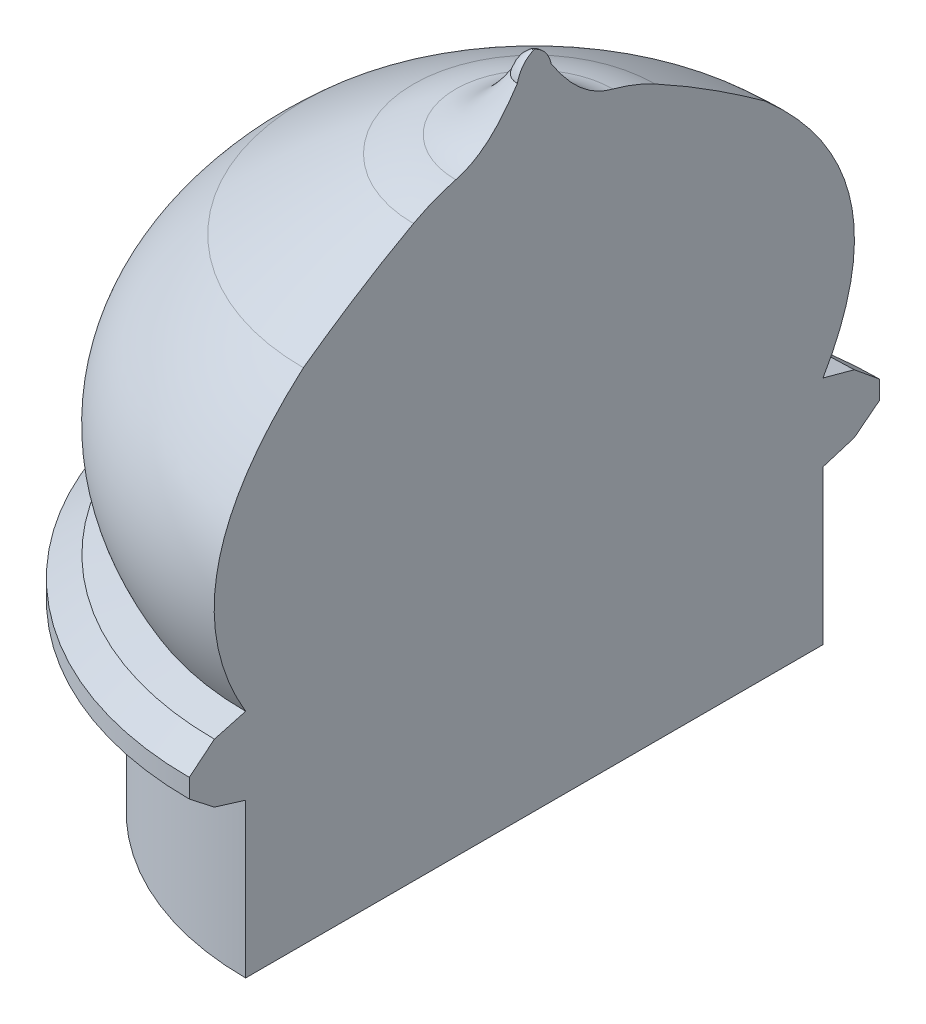
ISO-10303-21;
HEADER;
FILE_DESCRIPTION(('STEP AP214'),'2;1');
FILE_NAME('part.step','',(''),(''),'','','');
FILE_SCHEMA(('AUTOMOTIVE_DESIGN { 1 0 10303 214 1 1 1 1 }'));
ENDSEC;
DATA;
#1=APPLICATION_CONTEXT('core data for automotive mechanical design processes');
#2=APPLICATION_PROTOCOL_DEFINITION('international standard','automotive_design',2000,#1);
#3=PRODUCT_CONTEXT('',#1,'mechanical');
#4=PRODUCT('Part','Part','',(#3));
#5=PRODUCT_RELATED_PRODUCT_CATEGORY('part','',(#4));
#6=PRODUCT_DEFINITION_FORMATION('','',#4);
#7=PRODUCT_DEFINITION_CONTEXT('part definition',#1,'design');
#8=PRODUCT_DEFINITION('design','',#6,#7);
#9=PRODUCT_DEFINITION_SHAPE('','',#8);
#10=(LENGTH_UNIT() NAMED_UNIT(*) SI_UNIT(.MILLI.,.METRE.));
#11=(NAMED_UNIT(*) PLANE_ANGLE_UNIT() SI_UNIT($,.RADIAN.));
#12=(NAMED_UNIT(*) SI_UNIT($,.STERADIAN.) SOLID_ANGLE_UNIT());
#13=UNCERTAINTY_MEASURE_WITH_UNIT(LENGTH_MEASURE(1.E-05),#10,'distance_accuracy_value','');
#14=(GEOMETRIC_REPRESENTATION_CONTEXT(3) GLOBAL_UNCERTAINTY_ASSIGNED_CONTEXT((#13)) GLOBAL_UNIT_ASSIGNED_CONTEXT((#10,
#11,#12)) REPRESENTATION_CONTEXT('',''));
#15=CARTESIAN_POINT('',(0.,0.,0.));
#16=DIRECTION('',(0.,0.,1.));
#17=DIRECTION('',(1.,0.,0.));
#18=AXIS2_PLACEMENT_3D('',#15,#16,#17);
#19=CARTESIAN_POINT('',(0.,0.,0.));
#20=DIRECTION('',(0.,-1.,0.));
#21=DIRECTION('',(0.,0.,-1.));
#22=AXIS2_PLACEMENT_3D('',#19,#20,#21);
#23=PLANE('',#22);
#24=DIRECTION('',(0.,0.,1.));
#25=VECTOR('',#24,1.);
#26=CARTESIAN_POINT('',(0.,0.,0.));
#27=LINE('',#26,#25);
#28=CARTESIAN_POINT('',(1.33025439009923E-13,0.,-19.05));
#29=VERTEX_POINT('',#28);
#30=CARTESIAN_POINT('',(0.,0.,19.05));
#31=VERTEX_POINT('',#30);
#32=EDGE_CURVE('E180',#29,#31,#27,.T.);
#33=ORIENTED_EDGE('',*,*,#32,.T.);
#34=CARTESIAN_POINT('',(0.,0.,0.));
#35=DIRECTION('',(0.,1.,0.));
#36=DIRECTION('',(0.,0.,1.));
#37=AXIS2_PLACEMENT_3D('',#34,#35,#36);
#38=CIRCLE('',#37,19.05);
#39=EDGE_CURVE('E48',#29,#31,#38,.T.);
#40=ORIENTED_EDGE('',*,*,#39,.F.);
#41=EDGE_LOOP('',(#33,#40));
#42=FACE_BOUND('',#41,.T.);
#43=ADVANCED_FACE('F33',(#42),#23,.T.);
#44=CARTESIAN_POINT('',(0.,43.5542287768964,0.));
#45=CARTESIAN_POINT('',(0.,43.1584910491297,-0.886078473245657));
#46=CARTESIAN_POINT('',(0.,42.156292635422,-1.11862169887722));
#47=B_SPLINE_CURVE_WITH_KNOTS('',2,(#44,#45,#46),.UNSPECIFIED.,.F.,.F.,(3,3),(0.,1.),.UNSPECIFIED.);
#48=CARTESIAN_POINT('',(0.,43.5542287768964,0.));
#49=DIRECTION('',(0.,1.,0.));
#50=AXIS1_PLACEMENT('',#48,#49);
#51=SURFACE_OF_REVOLUTION('',#47,#50);
#52=CARTESIAN_POINT('',(0.,42.156292635422,0.));
#53=DIRECTION('',(0.,1.,0.));
#54=DIRECTION('',(0.,0.,1.));
#55=AXIS2_PLACEMENT_3D('',#52,#53,#54);
#56=CIRCLE('',#55,1.11862169887722);
#57=CARTESIAN_POINT('',(0.,42.156292635422,-1.11862169887722));
#58=VERTEX_POINT('',#57);
#59=CARTESIAN_POINT('',(0.,42.156292635422,1.11862169887722));
#60=VERTEX_POINT('',#59);
#61=EDGE_CURVE('E11',#58,#60,#56,.T.);
#62=ORIENTED_EDGE('',*,*,#61,.T.);
#63=CARTESIAN_POINT('',(0.,43.5542287768964,0.));
#64=CARTESIAN_POINT('',(0.,43.1584910491297,0.886078473245657));
#65=CARTESIAN_POINT('',(0.,42.156292635422,1.11862169887722));
#66=B_SPLINE_CURVE_WITH_KNOTS('',2,(#63,#64,#65),.UNSPECIFIED.,.F.,.F.,(3,3),(0.,1.),.UNSPECIFIED.);
#67=CARTESIAN_POINT('',(0.,43.5542287768964,0.));
#68=VERTEX_POINT('',#67);
#69=EDGE_CURVE('E120',#68,#60,#66,.T.);
#70=ORIENTED_EDGE('',*,*,#69,.F.);
#71=EDGE_CURVE('E122',#68,#58,#47,.T.);
#72=ORIENTED_EDGE('',*,*,#71,.T.);
#73=EDGE_LOOP('',(#62,#70,#72));
#74=FACE_BOUND('',#73,.T.);
#75=ADVANCED_FACE('F35',(#74),#51,.F.);
#76=CARTESIAN_POINT('',(0.,42.156292635422,-1.11862169887722));
#77=CARTESIAN_POINT('',(0.,40.6567927305474,-2.1048032632789));
#78=CARTESIAN_POINT('',(0.,39.1509662280635,-3.35105722555367));
#79=CARTESIAN_POINT('',(0.,38.6864077279948,-5.18636122685137));
#80=B_SPLINE_CURVE_WITH_KNOTS('',3,(#76,#77,#78,#79),.UNSPECIFIED.,.F.,.F.,(4,4),(0.,1.),.UNSPECIFIED.);
#81=CARTESIAN_POINT('',(0.,43.5542287768964,0.));
#82=DIRECTION('',(0.,1.,0.));
#83=AXIS1_PLACEMENT('',#81,#82);
#84=SURFACE_OF_REVOLUTION('',#80,#83);
#85=CARTESIAN_POINT('',(0.,38.6864077279948,0.));
#86=DIRECTION('',(0.,1.,0.));
#87=DIRECTION('',(0.,0.,1.));
#88=AXIS2_PLACEMENT_3D('',#85,#86,#87);
#89=CIRCLE('',#88,5.18636122685137);
#90=CARTESIAN_POINT('',(0.,38.6864077279948,-5.18636122685137));
#91=VERTEX_POINT('',#90);
#92=CARTESIAN_POINT('',(0.,38.6864077279948,5.18636122685137));
#93=VERTEX_POINT('',#92);
#94=EDGE_CURVE('E42',#91,#93,#89,.T.);
#95=ORIENTED_EDGE('',*,*,#94,.T.);
#96=CARTESIAN_POINT('',(0.,42.156292635422,1.11862169887722));
#97=CARTESIAN_POINT('',(0.,40.6567927305474,2.1048032632789));
#98=CARTESIAN_POINT('',(0.,39.1509662280635,3.35105722555367));
#99=CARTESIAN_POINT('',(0.,38.6864077279948,5.18636122685137));
#100=B_SPLINE_CURVE_WITH_KNOTS('',3,(#96,#97,#98,#99),.UNSPECIFIED.,.F.,.F.,(4,4),(0.,1.),.UNSPECIFIED.);
#101=EDGE_CURVE('E131',#60,#93,#100,.T.);
#102=ORIENTED_EDGE('',*,*,#101,.F.);
#103=ORIENTED_EDGE('',*,*,#61,.F.);
#104=EDGE_CURVE('E185',#58,#91,#80,.T.);
#105=ORIENTED_EDGE('',*,*,#104,.T.);
#106=EDGE_LOOP('',(#95,#102,#103,#105));
#107=FACE_BOUND('',#106,.T.);
#108=ADVANCED_FACE('F134',(#107),#84,.F.);
#109=CARTESIAN_POINT('',(0.,26.4127765045811,0.));
#110=DIRECTION('',(0.,1.,0.));
#111=DIRECTION('',(0.,0.,1.));
#112=AXIS2_PLACEMENT_3D('',#109,#110,#111);
#113=DEGENERATE_TOROIDAL_SURFACE('',#112,1.92323747932899,12.7,.T.);
#114=CARTESIAN_POINT('',(0.,37.578839170999,0.));
#115=DIRECTION('',(0.,1.,0.));
#116=DIRECTION('',(0.,0.,1.));
#117=AXIS2_PLACEMENT_3D('',#114,#115,#116);
#118=CIRCLE('',#117,7.9737783253714);
#119=CARTESIAN_POINT('',(0.,37.578839170999,-7.9737783253714));
#120=VERTEX_POINT('',#119);
#121=CARTESIAN_POINT('',(0.,37.578839170999,7.9737783253714));
#122=VERTEX_POINT('',#121);
#123=EDGE_CURVE('E258',#120,#122,#118,.T.);
#124=ORIENTED_EDGE('',*,*,#123,.T.);
#125=CARTESIAN_POINT('',(0.,26.4127765045811,1.92323747932899));
#126=DIRECTION('',(1.,0.,0.));
#127=DIRECTION('',(0.,0.,-1.));
#128=AXIS2_PLACEMENT_3D('',#125,#126,#127);
#129=CIRCLE('',#128,12.7);
#130=EDGE_CURVE('E135',#93,#122,#129,.T.);
#131=ORIENTED_EDGE('',*,*,#130,.F.);
#132=ORIENTED_EDGE('',*,*,#94,.F.);
#133=CARTESIAN_POINT('',(0.,26.4127765045811,-1.92323747932899));
#134=DIRECTION('',(-1.,0.,0.));
#135=DIRECTION('',(0.,0.,1.));
#136=AXIS2_PLACEMENT_3D('',#133,#134,#135);
#137=CIRCLE('',#136,12.7);
#138=EDGE_CURVE('E193',#91,#120,#137,.T.);
#139=ORIENTED_EDGE('',*,*,#138,.T.);
#140=EDGE_LOOP('',(#124,#131,#132,#139));
#141=FACE_BOUND('',#140,.T.);
#142=ADVANCED_FACE('F200',(#141),#113,.T.);
#143=CARTESIAN_POINT('',(0.,37.578839170999,-7.9737783253714));
#144=CARTESIAN_POINT('',(0.,37.4332726743377,-8.24241623150419));
#145=CARTESIAN_POINT('',(0.,36.0447468834401,-10.754138267883));
#146=CARTESIAN_POINT('',(0.,34.4667611992356,-13.1590560108881));
#147=CARTESIAN_POINT('',(1.06420351207939E-13,32.9695941861274,-15.24));
#148=B_SPLINE_CURVE_WITH_KNOTS('',3,(#143,#144,#145,#146,#147),.UNSPECIFIED.,.F.,.F.,(4,1,4),
(0.,0.0869963219725777,0.817134496217746),.UNSPECIFIED.);
#149=CARTESIAN_POINT('',(0.,43.5542287768964,0.));
#150=DIRECTION('',(0.,1.,0.));
#151=AXIS1_PLACEMENT('',#149,#150);
#152=SURFACE_OF_REVOLUTION('',#148,#151);
#153=CARTESIAN_POINT('',(0.,32.9695941861274,0.));
#154=DIRECTION('',(0.,1.,0.));
#155=DIRECTION('',(0.,0.,1.));
#156=AXIS2_PLACEMENT_3D('',#153,#154,#155);
#157=CIRCLE('',#156,15.24);
#158=CARTESIAN_POINT('',(1.06420351207939E-13,32.9695941861274,-15.24));
#159=VERTEX_POINT('',#158);
#160=CARTESIAN_POINT('',(0.,32.9695941861274,15.24));
#161=VERTEX_POINT('',#160);
#162=EDGE_CURVE('E256',#159,#161,#157,.T.);
#163=ORIENTED_EDGE('',*,*,#162,.T.);
#164=CARTESIAN_POINT('',(0.,37.578839170999,7.9737783253714));
#165=CARTESIAN_POINT('',(0.,37.4332726743377,8.24241623150419));
#166=CARTESIAN_POINT('',(0.,36.0447468834401,10.754138267883));
#167=CARTESIAN_POINT('',(0.,34.4667611992356,13.1590560108881));
#168=CARTESIAN_POINT('',(0.,32.9695941861274,15.24));
#169=B_SPLINE_CURVE_WITH_KNOTS('',3,(#164,#165,#166,#167,#168),.UNSPECIFIED.,.F.,.F.,(4,1,4),
(0.,0.0869963219725777,0.817134496217746),.UNSPECIFIED.);
#170=EDGE_CURVE('E137',#122,#161,#169,.T.);
#171=ORIENTED_EDGE('',*,*,#170,.F.);
#172=ORIENTED_EDGE('',*,*,#123,.F.);
#173=EDGE_CURVE('E211',#120,#159,#148,.T.);
#174=ORIENTED_EDGE('',*,*,#173,.T.);
#175=EDGE_LOOP('',(#163,#171,#172,#174));
#176=FACE_BOUND('',#175,.T.);
#177=ADVANCED_FACE('F203',(#176),#152,.F.);
#178=CARTESIAN_POINT('',(1.06420351207939E-13,32.9695941861274,-15.24));
#179=CARTESIAN_POINT('',(1.71917437599164E-13,24.713120096452,-24.6195555574883));
#180=CARTESIAN_POINT('',(1.33025439009923E-13,15.24,-19.05));
#181=B_SPLINE_CURVE_WITH_KNOTS('',2,(#178,#179,#180),.UNSPECIFIED.,.F.,.F.,(3,3),(0.,1.),.UNSPECIFIED.);
#182=CARTESIAN_POINT('',(0.,43.5542287768964,0.));
#183=DIRECTION('',(0.,1.,0.));
#184=AXIS1_PLACEMENT('',#182,#183);
#185=SURFACE_OF_REVOLUTION('',#181,#184);
#186=CARTESIAN_POINT('',(0.,15.24,0.));
#187=DIRECTION('',(0.,1.,0.));
#188=DIRECTION('',(0.,0.,1.));
#189=AXIS2_PLACEMENT_3D('',#186,#187,#188);
#190=CIRCLE('',#189,19.05);
#191=CARTESIAN_POINT('',(1.33025439009923E-13,15.24,-19.05));
#192=VERTEX_POINT('',#191);
#193=CARTESIAN_POINT('',(0.,15.24,19.05));
#194=VERTEX_POINT('',#193);
#195=EDGE_CURVE('E254',#192,#194,#190,.T.);
#196=ORIENTED_EDGE('',*,*,#195,.T.);
#197=CARTESIAN_POINT('',(0.,32.9695941861274,15.24));
#198=CARTESIAN_POINT('',(0.,24.713120096452,24.6195555574883));
#199=CARTESIAN_POINT('',(0.,15.24,19.05));
#200=B_SPLINE_CURVE_WITH_KNOTS('',2,(#197,#198,#199),.UNSPECIFIED.,.F.,.F.,(3,3),(0.,1.),.UNSPECIFIED.);
#201=EDGE_CURVE('E151',#161,#194,#200,.T.);
#202=ORIENTED_EDGE('',*,*,#201,.F.);
#203=ORIENTED_EDGE('',*,*,#162,.F.);
#204=EDGE_CURVE('E216',#159,#192,#181,.T.);
#205=ORIENTED_EDGE('',*,*,#204,.T.);
#206=EDGE_LOOP('',(#196,#202,#203,#205));
#207=FACE_BOUND('',#206,.T.);
#208=ADVANCED_FACE('F207',(#207),#185,.F.);
#209=CARTESIAN_POINT('',(0.,15.24,0.));
#210=DIRECTION('',(0.,-1.,0.));
#211=DIRECTION('',(0.,0.,-1.));
#212=AXIS2_PLACEMENT_3D('',#209,#210,#211);
#213=CONICAL_SURFACE('',#212,19.05,1.30586539917777);
#214=CARTESIAN_POINT('',(0.,14.6806431808635,0.));
#215=DIRECTION('',(0.,1.,0.));
#216=DIRECTION('',(0.,0.,1.));
#217=AXIS2_PLACEMENT_3D('',#214,#215,#216);
#218=CIRCLE('',#217,21.1117010997163);
#219=CARTESIAN_POINT('',(1.47422220841787E-13,14.6806431808635,-21.1117010997163));
#220=VERTEX_POINT('',#219);
#221=CARTESIAN_POINT('',(0.,14.6806431808635,21.1117010997163));
#222=VERTEX_POINT('',#221);
#223=EDGE_CURVE('E252',#220,#222,#218,.T.);
#224=ORIENTED_EDGE('',*,*,#223,.T.);
#225=DIRECTION('',(0.,-0.261842606286069,0.965110589276337));
#226=VECTOR('',#225,1.);
#227=CARTESIAN_POINT('',(0.,14.6806431808635,21.1117010997163));
#228=LINE('',#227,#226);
#229=EDGE_CURVE('E159',#194,#222,#228,.T.);
#230=ORIENTED_EDGE('',*,*,#229,.F.);
#231=ORIENTED_EDGE('',*,*,#195,.F.);
#232=DIRECTION('',(0.,-0.261842606286069,-0.965110589276337));
#233=VECTOR('',#232,1.);
#234=CARTESIAN_POINT('',(1.47422220841787E-13,14.6806431808635,-21.1117010997163));
#235=LINE('',#234,#233);
#236=EDGE_CURVE('E225',#192,#220,#235,.T.);
#237=ORIENTED_EDGE('',*,*,#236,.T.);
#238=EDGE_LOOP('',(#224,#230,#231,#237));
#239=FACE_BOUND('',#238,.T.);
#240=ADVANCED_FACE('F270',(#239),#213,.T.);
#241=CARTESIAN_POINT('',(0.,14.6806431808635,0.));
#242=DIRECTION('',(0.,-1.,0.));
#243=DIRECTION('',(0.,0.,-1.));
#244=AXIS2_PLACEMENT_3D('',#241,#242,#243);
#245=CONICAL_SURFACE('',#244,21.1117010997163,0.884216258093348);
#246=CARTESIAN_POINT('',(0.,13.3233278651338,0.));
#247=DIRECTION('',(0.,1.,0.));
#248=DIRECTION('',(0.,0.,1.));
#249=AXIS2_PLACEMENT_3D('',#246,#247,#248);
#250=CIRCLE('',#249,22.767765968934);
#251=CARTESIAN_POINT('',(1.58986460015362E-13,13.3233278651338,-22.767765968934));
#252=VERTEX_POINT('',#251);
#253=CARTESIAN_POINT('',(0.,13.3233278651338,22.767765968934));
#254=VERTEX_POINT('',#253);
#255=EDGE_CURVE('E250',#252,#254,#250,.T.);
#256=ORIENTED_EDGE('',*,*,#255,.T.);
#257=DIRECTION('',(0.,-0.633895856534455,0.773418413970374));
#258=VECTOR('',#257,1.);
#259=CARTESIAN_POINT('',(0.,13.3233278651338,22.767765968934));
#260=LINE('',#259,#258);
#261=EDGE_CURVE('E165',#222,#254,#260,.T.);
#262=ORIENTED_EDGE('',*,*,#261,.F.);
#263=ORIENTED_EDGE('',*,*,#223,.F.);
#264=DIRECTION('',(0.,-0.633895856534455,-0.773418413970374));
#265=VECTOR('',#264,1.);
#266=CARTESIAN_POINT('',(1.58986460015362E-13,13.3233278651338,-22.767765968934));
#267=LINE('',#266,#265);
#268=EDGE_CURVE('E231',#220,#252,#267,.T.);
#269=ORIENTED_EDGE('',*,*,#268,.T.);
#270=EDGE_LOOP('',(#256,#262,#263,#269));
#271=FACE_BOUND('',#270,.T.);
#272=ADVANCED_FACE('F273',(#271),#245,.T.);
#273=CARTESIAN_POINT('',(0.,43.5542287768964,0.));
#274=DIRECTION('',(0.,1.,0.));
#275=DIRECTION('',(0.,0.,1.));
#276=AXIS2_PLACEMENT_3D('',#273,#274,#275);
#277=CYLINDRICAL_SURFACE('',#276,22.767765968934);
#278=CARTESIAN_POINT('',(0.,12.084590197272,0.));
#279=DIRECTION('',(0.,1.,0.));
#280=DIRECTION('',(0.,0.,1.));
#281=AXIS2_PLACEMENT_3D('',#278,#279,#280);
#282=CIRCLE('',#281,22.767765968934);
#283=CARTESIAN_POINT('',(1.58986460015362E-13,12.084590197272,-22.767765968934));
#284=VERTEX_POINT('',#283);
#285=CARTESIAN_POINT('',(0.,12.084590197272,22.767765968934));
#286=VERTEX_POINT('',#285);
#287=EDGE_CURVE('E248',#284,#286,#282,.T.);
#288=ORIENTED_EDGE('',*,*,#287,.T.);
#289=DIRECTION('',(0.,-1.,0.));
#290=VECTOR('',#289,1.);
#291=CARTESIAN_POINT('',(0.,12.084590197272,22.767765968934));
#292=LINE('',#291,#290);
#293=EDGE_CURVE('E168',#254,#286,#292,.T.);
#294=ORIENTED_EDGE('',*,*,#293,.F.);
#295=ORIENTED_EDGE('',*,*,#255,.F.);
#296=DIRECTION('',(0.,-1.,0.));
#297=VECTOR('',#296,1.);
#298=CARTESIAN_POINT('',(1.58986460015362E-13,12.084590197272,-22.767765968934));
#299=LINE('',#298,#297);
#300=EDGE_CURVE('E234',#252,#284,#299,.T.);
#301=ORIENTED_EDGE('',*,*,#300,.T.);
#302=EDGE_LOOP('',(#288,#294,#295,#301));
#303=FACE_BOUND('',#302,.T.);
#304=ADVANCED_FACE('F278',(#303),#277,.T.);
#305=CARTESIAN_POINT('',(0.,12.084590197272,0.));
#306=DIRECTION('',(0.,1.,0.));
#307=DIRECTION('',(0.,0.,1.));
#308=AXIS2_PLACEMENT_3D('',#305,#306,#307);
#309=CONICAL_SURFACE('',#308,22.767765968934,0.909174106703724);
#310=CARTESIAN_POINT('',(0.,10.795,0.));
#311=DIRECTION('',(0.,1.,0.));
#312=DIRECTION('',(0.,0.,1.));
#313=AXIS2_PLACEMENT_3D('',#310,#311,#312);
#314=CIRCLE('',#313,21.1117010997163);
#315=CARTESIAN_POINT('',(1.47422220841787E-13,10.795,-21.1117010997163));
#316=VERTEX_POINT('',#315);
#317=CARTESIAN_POINT('',(0.,10.795,21.1117010997163));
#318=VERTEX_POINT('',#317);
#319=EDGE_CURVE('E246',#316,#318,#314,.T.);
#320=ORIENTED_EDGE('',*,*,#319,.T.);
#321=DIRECTION('',(0.,-0.614397585942785,-0.788996581987323));
#322=VECTOR('',#321,1.);
#323=CARTESIAN_POINT('',(0.,10.795,21.1117010997163));
#324=LINE('',#323,#322);
#325=EDGE_CURVE('E171',#286,#318,#324,.T.);
#326=ORIENTED_EDGE('',*,*,#325,.F.);
#327=ORIENTED_EDGE('',*,*,#287,.F.);
#328=DIRECTION('',(0.,-0.614397585942785,0.788996581987323));
#329=VECTOR('',#328,1.);
#330=CARTESIAN_POINT('',(1.47422220841787E-13,10.795,-21.1117010997163));
#331=LINE('',#330,#329);
#332=EDGE_CURVE('E237',#284,#316,#331,.T.);
#333=ORIENTED_EDGE('',*,*,#332,.T.);
#334=EDGE_LOOP('',(#320,#326,#327,#333));
#335=FACE_BOUND('',#334,.T.);
#336=ADVANCED_FACE('F281',(#335),#309,.T.);
#337=CARTESIAN_POINT('',(0.,10.795,0.));
#338=DIRECTION('',(0.,1.,0.));
#339=DIRECTION('',(0.,0.,1.));
#340=AXIS2_PLACEMENT_3D('',#337,#338,#339);
#341=CONICAL_SURFACE('',#340,21.1117010997163,1.27201808333505);
#342=CARTESIAN_POINT('',(0.,10.16,0.));
#343=DIRECTION('',(0.,1.,0.));
#344=DIRECTION('',(0.,0.,1.));
#345=AXIS2_PLACEMENT_3D('',#342,#343,#344);
#346=CIRCLE('',#345,19.05);
#347=CARTESIAN_POINT('',(1.33025439009923E-13,10.16,-19.05));
#348=VERTEX_POINT('',#347);
#349=CARTESIAN_POINT('',(0.,10.16,19.05));
#350=VERTEX_POINT('',#349);
#351=EDGE_CURVE('E56',#348,#350,#346,.T.);
#352=ORIENTED_EDGE('',*,*,#351,.T.);
#353=DIRECTION('',(0.,-0.294352797788221,-0.955696829770951));
#354=VECTOR('',#353,1.);
#355=CARTESIAN_POINT('',(0.,10.16,19.05));
#356=LINE('',#355,#354);
#357=EDGE_CURVE('E174',#318,#350,#356,.T.);
#358=ORIENTED_EDGE('',*,*,#357,.F.);
#359=ORIENTED_EDGE('',*,*,#319,.F.);
#360=DIRECTION('',(0.,-0.294352797788221,0.955696829770951));
#361=VECTOR('',#360,1.);
#362=CARTESIAN_POINT('',(1.33025439009923E-13,10.16,-19.05));
#363=LINE('',#362,#361);
#364=EDGE_CURVE('E240',#316,#348,#363,.T.);
#365=ORIENTED_EDGE('',*,*,#364,.T.);
#366=EDGE_LOOP('',(#352,#358,#359,#365));
#367=FACE_BOUND('',#366,.T.);
#368=ADVANCED_FACE('F285',(#367),#341,.T.);
#369=CARTESIAN_POINT('',(0.,43.5542287768964,0.));
#370=DIRECTION('',(0.,1.,0.));
#371=DIRECTION('',(0.,0.,1.));
#372=AXIS2_PLACEMENT_3D('',#369,#370,#371);
#373=CYLINDRICAL_SURFACE('',#372,19.05);
#374=DIRECTION('',(0.,-1.,0.));
#375=VECTOR('',#374,1.);
#376=CARTESIAN_POINT('',(1.33025439009923E-13,0.,-19.05));
#377=LINE('',#376,#375);
#378=EDGE_CURVE('E242',#348,#29,#377,.T.);
#379=ORIENTED_EDGE('',*,*,#378,.T.);
#380=ORIENTED_EDGE('',*,*,#39,.T.);
#381=DIRECTION('',(0.,-1.,0.));
#382=VECTOR('',#381,1.);
#383=CARTESIAN_POINT('',(0.,0.,19.05));
#384=LINE('',#383,#382);
#385=EDGE_CURVE('E177',#350,#31,#384,.T.);
#386=ORIENTED_EDGE('',*,*,#385,.F.);
#387=ORIENTED_EDGE('',*,*,#351,.F.);
#388=EDGE_LOOP('',(#379,#380,#386,#387));
#389=FACE_BOUND('',#388,.T.);
#390=ADVANCED_FACE('F287',(#389),#373,.T.);
#391=CARTESIAN_POINT('',(1.45820166354048E-13,24.4089585947578,-20.8822777787441));
#392=DIRECTION('',(-1.,0.,0.));
#393=DIRECTION('',(0.,0.,1.));
#394=AXIS2_PLACEMENT_3D('',#391,#392,#393);
#395=PLANE('',#394);
#396=ORIENTED_EDGE('',*,*,#32,.F.);
#397=ORIENTED_EDGE('',*,*,#378,.F.);
#398=ORIENTED_EDGE('',*,*,#364,.F.);
#399=ORIENTED_EDGE('',*,*,#332,.F.);
#400=ORIENTED_EDGE('',*,*,#300,.F.);
#401=ORIENTED_EDGE('',*,*,#268,.F.);
#402=ORIENTED_EDGE('',*,*,#236,.F.);
#403=ORIENTED_EDGE('',*,*,#204,.F.);
#404=ORIENTED_EDGE('',*,*,#173,.F.);
#405=ORIENTED_EDGE('',*,*,#138,.F.);
#406=ORIENTED_EDGE('',*,*,#104,.F.);
#407=ORIENTED_EDGE('',*,*,#71,.F.);
#408=ORIENTED_EDGE('',*,*,#69,.T.);
#409=ORIENTED_EDGE('',*,*,#101,.T.);
#410=ORIENTED_EDGE('',*,*,#130,.T.);
#411=ORIENTED_EDGE('',*,*,#170,.T.);
#412=ORIENTED_EDGE('',*,*,#201,.T.);
#413=ORIENTED_EDGE('',*,*,#229,.T.);
#414=ORIENTED_EDGE('',*,*,#261,.T.);
#415=ORIENTED_EDGE('',*,*,#293,.T.);
#416=ORIENTED_EDGE('',*,*,#325,.T.);
#417=ORIENTED_EDGE('',*,*,#357,.T.);
#418=ORIENTED_EDGE('',*,*,#385,.T.);
#419=EDGE_LOOP('',(#396,#397,#398,#399,#400,#401,#402,#403,#404,#405,#406,#407,#408,#409,#410,
#411,#412,#413,#414,#415,#416,#417,#418));
#420=FACE_BOUND('',#419,.T.);
#421=ADVANCED_FACE('F129',(#420),#395,.F.);
#422=CLOSED_SHELL('',(#43,#75,#108,#142,#177,#208,#240,#272,#304,#336,#368,#390,#421));
#423=MANIFOLD_SOLID_BREP('B2',#422);
#424=ADVANCED_BREP_SHAPE_REPRESENTATION('',(#18,#423),#14);
#425=SHAPE_DEFINITION_REPRESENTATION(#9,#424);
ENDSEC;
END-ISO-10303-21;
